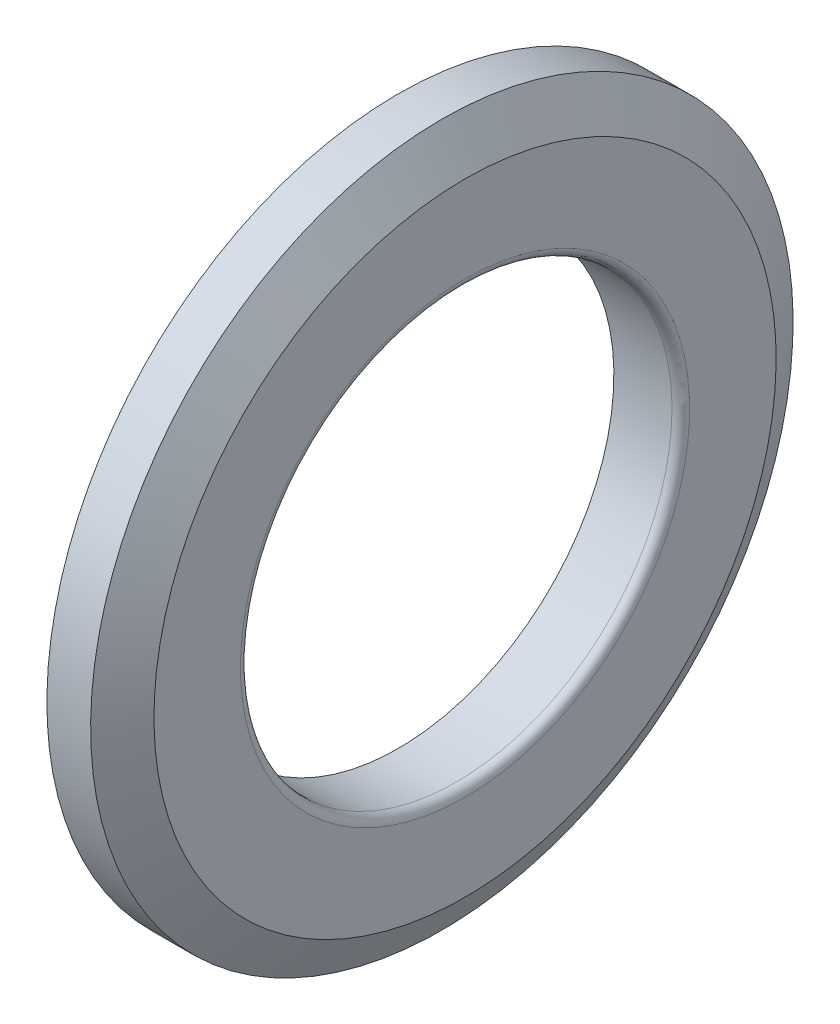
ISO-10303-21;
HEADER;
FILE_DESCRIPTION(('STEP AP214'),'2;1');
FILE_NAME('part.step','',(''),(''),'','','');
FILE_SCHEMA(('AUTOMOTIVE_DESIGN { 1 0 10303 214 1 1 1 1 }'));
ENDSEC;
DATA;
#1=APPLICATION_CONTEXT('core data for automotive mechanical design processes');
#2=APPLICATION_PROTOCOL_DEFINITION('international standard','automotive_design',2000,#1);
#3=PRODUCT_CONTEXT('',#1,'mechanical');
#4=PRODUCT('Part','Part','',(#3));
#5=PRODUCT_RELATED_PRODUCT_CATEGORY('part','',(#4));
#6=PRODUCT_DEFINITION_FORMATION('','',#4);
#7=PRODUCT_DEFINITION_CONTEXT('part definition',#1,'design');
#8=PRODUCT_DEFINITION('design','',#6,#7);
#9=PRODUCT_DEFINITION_SHAPE('','',#8);
#10=(LENGTH_UNIT() NAMED_UNIT(*) SI_UNIT(.MILLI.,.METRE.));
#11=(NAMED_UNIT(*) PLANE_ANGLE_UNIT() SI_UNIT($,.RADIAN.));
#12=(NAMED_UNIT(*) SI_UNIT($,.STERADIAN.) SOLID_ANGLE_UNIT());
#13=UNCERTAINTY_MEASURE_WITH_UNIT(LENGTH_MEASURE(1.E-05),#10,'distance_accuracy_value','');
#14=(GEOMETRIC_REPRESENTATION_CONTEXT(3) GLOBAL_UNCERTAINTY_ASSIGNED_CONTEXT((#13)) GLOBAL_UNIT_ASSIGNED_CONTEXT((#10,
#11,#12)) REPRESENTATION_CONTEXT('',''));
#15=CARTESIAN_POINT('',(0.,0.,0.));
#16=DIRECTION('',(0.,0.,1.));
#17=DIRECTION('',(1.,0.,0.));
#18=AXIS2_PLACEMENT_3D('',#15,#16,#17);
#19=CARTESIAN_POINT('',(6.66666666666667,16.7374996878901,0.));
#20=DIRECTION('',(-1.,0.,0.));
#21=DIRECTION('',(0.,-1.,0.));
#22=AXIS2_PLACEMENT_3D('',#19,#20,#21);
#23=PLANE('',#22);
#24=CARTESIAN_POINT('',(6.66666666666667,0.,0.));
#25=DIRECTION('',(1.,0.,0.));
#26=DIRECTION('',(0.,1.,0.));
#27=AXIS2_PLACEMENT_3D('',#24,#25,#26);
#28=CIRCLE('',#27,15.9749993757802);
#29=CARTESIAN_POINT('',(6.66666666666667,15.9749993757802,0.));
#30=VERTEX_POINT('',#29);
#31=EDGE_CURVE('E11',#30,#30,#28,.T.);
#32=ORIENTED_EDGE('',*,*,#31,.T.);
#33=EDGE_LOOP('',(#32));
#34=FACE_BOUND('',#33,.T.);
#35=CARTESIAN_POINT('',(6.66666666666667,0.,0.));
#36=DIRECTION('',(1.,0.,0.));
#37=DIRECTION('',(0.,1.,0.));
#38=AXIS2_PLACEMENT_3D('',#35,#36,#37);
#39=CIRCLE('',#38,17.5);
#40=CARTESIAN_POINT('',(6.66666666666667,17.5,0.));
#41=VERTEX_POINT('',#40);
#42=EDGE_CURVE('E64',#41,#41,#39,.T.);
#43=ORIENTED_EDGE('',*,*,#42,.F.);
#44=EDGE_LOOP('',(#43));
#45=FACE_BOUND('',#44,.T.);
#46=ADVANCED_FACE('F16',(#34,#45),#23,.T.);
#47=CARTESIAN_POINT('',(5.,0.,0.));
#48=DIRECTION('',(1.,0.,0.));
#49=DIRECTION('',(0.,0.,1.));
#50=AXIS2_PLACEMENT_3D('',#47,#48,#49);
#51=TOROIDAL_SURFACE('',#50,13.75,2.78);
#52=CARTESIAN_POINT('',(6.66666666666667,0.,0.));
#53=DIRECTION('',(1.,0.,0.));
#54=DIRECTION('',(0.,1.,0.));
#55=AXIS2_PLACEMENT_3D('',#52,#53,#54);
#56=CIRCLE('',#55,11.5250006242198);
#57=CARTESIAN_POINT('',(6.66666666666667,11.5250006242198,0.));
#58=VERTEX_POINT('',#57);
#59=EDGE_CURVE('E26',#58,#58,#56,.T.);
#60=ORIENTED_EDGE('',*,*,#59,.T.);
#61=EDGE_LOOP('',(#60));
#62=FACE_BOUND('',#61,.T.);
#63=ORIENTED_EDGE('',*,*,#31,.F.);
#64=EDGE_LOOP('',(#63));
#65=FACE_BOUND('',#64,.T.);
#66=ADVANCED_FACE('F18',(#62,#65),#51,.F.);
#67=CARTESIAN_POINT('',(6.66666666666667,11.1375003121099,0.));
#68=DIRECTION('',(-1.,0.,0.));
#69=DIRECTION('',(0.,-1.,0.));
#70=AXIS2_PLACEMENT_3D('',#67,#68,#69);
#71=PLANE('',#70);
#72=CARTESIAN_POINT('',(6.66666666666667,0.,0.));
#73=DIRECTION('',(1.,0.,0.));
#74=DIRECTION('',(0.,1.,0.));
#75=AXIS2_PLACEMENT_3D('',#72,#73,#74);
#76=CIRCLE('',#75,10.75);
#77=CARTESIAN_POINT('',(6.66666666666667,10.75,0.));
#78=VERTEX_POINT('',#77);
#79=EDGE_CURVE('E20',#78,#78,#76,.T.);
#80=ORIENTED_EDGE('',*,*,#79,.T.);
#81=EDGE_LOOP('',(#80));
#82=FACE_BOUND('',#81,.T.);
#83=ORIENTED_EDGE('',*,*,#59,.F.);
#84=EDGE_LOOP('',(#83));
#85=FACE_BOUND('',#84,.T.);
#86=ADVANCED_FACE('F49',(#82,#85),#71,.T.);
#87=CARTESIAN_POINT('',(8.11458333333334,0.,0.));
#88=DIRECTION('',(-1.,0.,0.));
#89=DIRECTION('',(0.,1.,0.));
#90=AXIS2_PLACEMENT_3D('',#87,#88,#89);
#91=CYLINDRICAL_SURFACE('',#90,10.75);
#92=CARTESIAN_POINT('',(9.5625,0.,0.));
#93=DIRECTION('',(1.,0.,0.));
#94=DIRECTION('',(0.,1.,0.));
#95=AXIS2_PLACEMENT_3D('',#92,#93,#94);
#96=CIRCLE('',#95,10.75);
#97=CARTESIAN_POINT('',(9.5625,10.75,0.));
#98=VERTEX_POINT('',#97);
#99=EDGE_CURVE('E52',#98,#98,#96,.T.);
#100=ORIENTED_EDGE('',*,*,#99,.T.);
#101=EDGE_LOOP('',(#100));
#102=FACE_BOUND('',#101,.T.);
#103=ORIENTED_EDGE('',*,*,#79,.F.);
#104=EDGE_LOOP('',(#103));
#105=FACE_BOUND('',#104,.T.);
#106=ADVANCED_FACE('F84',(#102,#105),#91,.F.);
#107=CARTESIAN_POINT('',(9.5625,0.,0.));
#108=DIRECTION('',(1.,0.,0.));
#109=DIRECTION('',(0.,0.,1.));
#110=AXIS2_PLACEMENT_3D('',#107,#108,#109);
#111=TOROIDAL_SURFACE('',#110,11.1875,0.4375);
#112=CARTESIAN_POINT('',(10.,0.,0.));
#113=DIRECTION('',(1.,0.,0.));
#114=DIRECTION('',(0.,1.,0.));
#115=AXIS2_PLACEMENT_3D('',#112,#113,#114);
#116=CIRCLE('',#115,11.1875);
#117=CARTESIAN_POINT('',(10.,11.1875,0.));
#118=VERTEX_POINT('',#117);
#119=EDGE_CURVE('E54',#118,#118,#116,.T.);
#120=ORIENTED_EDGE('',*,*,#119,.T.);
#121=EDGE_LOOP('',(#120));
#122=FACE_BOUND('',#121,.T.);
#123=ORIENTED_EDGE('',*,*,#99,.F.);
#124=EDGE_LOOP('',(#123));
#125=FACE_BOUND('',#124,.T.);
#126=ADVANCED_FACE('F87',(#122,#125),#111,.T.);
#127=CARTESIAN_POINT('',(10.,13.34375,0.));
#128=DIRECTION('',(1.,0.,0.));
#129=DIRECTION('',(0.,1.,0.));
#130=AXIS2_PLACEMENT_3D('',#127,#128,#129);
#131=PLANE('',#130);
#132=CARTESIAN_POINT('',(10.,0.,0.));
#133=DIRECTION('',(1.,0.,0.));
#134=DIRECTION('',(0.,1.,0.));
#135=AXIS2_PLACEMENT_3D('',#132,#133,#134);
#136=CIRCLE('',#135,15.5);
#137=CARTESIAN_POINT('',(10.,15.5,0.));
#138=VERTEX_POINT('',#137);
#139=EDGE_CURVE('E58',#138,#138,#136,.T.);
#140=ORIENTED_EDGE('',*,*,#139,.T.);
#141=EDGE_LOOP('',(#140));
#142=FACE_BOUND('',#141,.T.);
#143=ORIENTED_EDGE('',*,*,#119,.F.);
#144=EDGE_LOOP('',(#143));
#145=FACE_BOUND('',#144,.T.);
#146=ADVANCED_FACE('F88',(#142,#145),#131,.T.);
#147=CARTESIAN_POINT('',(9.42264973081037,0.,0.));
#148=DIRECTION('',(-1.,0.,0.));
#149=DIRECTION('',(0.,1.,0.));
#150=AXIS2_PLACEMENT_3D('',#147,#148,#149);
#151=CONICAL_SURFACE('',#150,16.5,1.0471975511966);
#152=CARTESIAN_POINT('',(8.84529946162075,0.,0.));
#153=DIRECTION('',(1.,0.,0.));
#154=DIRECTION('',(0.,1.,0.));
#155=AXIS2_PLACEMENT_3D('',#152,#153,#154);
#156=CIRCLE('',#155,17.5);
#157=CARTESIAN_POINT('',(8.84529946162075,17.5,0.));
#158=VERTEX_POINT('',#157);
#159=EDGE_CURVE('E61',#158,#158,#156,.T.);
#160=ORIENTED_EDGE('',*,*,#159,.T.);
#161=EDGE_LOOP('',(#160));
#162=FACE_BOUND('',#161,.T.);
#163=ORIENTED_EDGE('',*,*,#139,.F.);
#164=EDGE_LOOP('',(#163));
#165=FACE_BOUND('',#164,.T.);
#166=ADVANCED_FACE('F83',(#162,#165),#151,.T.);
#167=CARTESIAN_POINT('',(7.75598306414371,0.,0.));
#168=DIRECTION('',(-1.,0.,0.));
#169=DIRECTION('',(0.,1.,0.));
#170=AXIS2_PLACEMENT_3D('',#167,#168,#169);
#171=CYLINDRICAL_SURFACE('',#170,17.5);
#172=ORIENTED_EDGE('',*,*,#42,.T.);
#173=EDGE_LOOP('',(#172));
#174=FACE_BOUND('',#173,.T.);
#175=ORIENTED_EDGE('',*,*,#159,.F.);
#176=EDGE_LOOP('',(#175));
#177=FACE_BOUND('',#176,.T.);
#178=ADVANCED_FACE('F68',(#174,#177),#171,.T.);
#179=CLOSED_SHELL('',(#46,#66,#86,#106,#126,#146,#166,#178));
#180=MANIFOLD_SOLID_BREP('B1',#179);
#181=ADVANCED_BREP_SHAPE_REPRESENTATION('',(#18,#180),#14);
#182=SHAPE_DEFINITION_REPRESENTATION(#9,#181);
ENDSEC;
END-ISO-10303-21;
